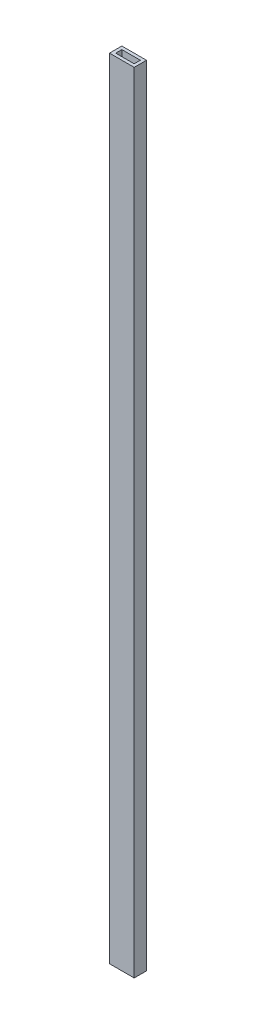
ISO-10303-21;
HEADER;
FILE_DESCRIPTION(('STEP AP214'),'2;1');
FILE_NAME('part.step','',(''),(''),'','','');
FILE_SCHEMA(('AUTOMOTIVE_DESIGN { 1 0 10303 214 1 1 1 1 }'));
ENDSEC;
DATA;
#1=APPLICATION_CONTEXT('core data for automotive mechanical design processes');
#2=APPLICATION_PROTOCOL_DEFINITION('international standard','automotive_design',2000,#1);
#3=PRODUCT_CONTEXT('',#1,'mechanical');
#4=PRODUCT('Part','Part','',(#3));
#5=PRODUCT_RELATED_PRODUCT_CATEGORY('part','',(#4));
#6=PRODUCT_DEFINITION_FORMATION('','',#4);
#7=PRODUCT_DEFINITION_CONTEXT('part definition',#1,'design');
#8=PRODUCT_DEFINITION('design','',#6,#7);
#9=PRODUCT_DEFINITION_SHAPE('','',#8);
#10=(LENGTH_UNIT() NAMED_UNIT(*) SI_UNIT(.MILLI.,.METRE.));
#11=(NAMED_UNIT(*) PLANE_ANGLE_UNIT() SI_UNIT($,.RADIAN.));
#12=(NAMED_UNIT(*) SI_UNIT($,.STERADIAN.) SOLID_ANGLE_UNIT());
#13=UNCERTAINTY_MEASURE_WITH_UNIT(LENGTH_MEASURE(1.E-05),#10,'distance_accuracy_value','');
#14=(GEOMETRIC_REPRESENTATION_CONTEXT(3) GLOBAL_UNCERTAINTY_ASSIGNED_CONTEXT((#13)) GLOBAL_UNIT_ASSIGNED_CONTEXT((#10,
#11,#12)) REPRESENTATION_CONTEXT('',''));
#15=CARTESIAN_POINT('',(0.,0.,0.));
#16=DIRECTION('',(0.,0.,1.));
#17=DIRECTION('',(1.,0.,0.));
#18=AXIS2_PLACEMENT_3D('',#15,#16,#17);
#19=CARTESIAN_POINT('',(0.,812.8,0.));
#20=DIRECTION('',(0.,1.,0.));
#21=DIRECTION('',(0.,0.,1.));
#22=AXIS2_PLACEMENT_3D('',#19,#20,#21);
#23=PLANE('',#22);
#24=DIRECTION('',(0.,0.,1.));
#25=VECTOR('',#24,1.);
#26=CARTESIAN_POINT('',(0.,812.8,0.));
#27=LINE('',#26,#25);
#28=CARTESIAN_POINT('',(0.,812.8,-12.7));
#29=VERTEX_POINT('',#28);
#30=CARTESIAN_POINT('',(0.,812.8,0.));
#31=VERTEX_POINT('',#30);
#32=EDGE_CURVE('E158',#29,#31,#27,.T.);
#33=ORIENTED_EDGE('',*,*,#32,.T.);
#34=DIRECTION('',(1.,0.,0.));
#35=VECTOR('',#34,1.);
#36=CARTESIAN_POINT('',(0.,812.8,0.));
#37=LINE('',#36,#35);
#38=CARTESIAN_POINT('',(25.4,812.8,0.));
#39=VERTEX_POINT('',#38);
#40=EDGE_CURVE('E161',#31,#39,#37,.T.);
#41=ORIENTED_EDGE('',*,*,#40,.T.);
#42=DIRECTION('',(0.,0.,-1.));
#43=VECTOR('',#42,1.);
#44=CARTESIAN_POINT('',(25.4,812.8,0.));
#45=LINE('',#44,#43);
#46=CARTESIAN_POINT('',(25.4,812.8,-12.7));
#47=VERTEX_POINT('',#46);
#48=EDGE_CURVE('E164',#39,#47,#45,.T.);
#49=ORIENTED_EDGE('',*,*,#48,.T.);
#50=DIRECTION('',(-1.,0.,0.));
#51=VECTOR('',#50,1.);
#52=CARTESIAN_POINT('',(0.,812.8,-12.7));
#53=LINE('',#52,#51);
#54=EDGE_CURVE('E166',#47,#29,#53,.T.);
#55=ORIENTED_EDGE('',*,*,#54,.T.);
#56=EDGE_LOOP('',(#33,#41,#49,#55));
#57=FACE_BOUND('',#56,.T.);
#58=DIRECTION('',(1.,0.,0.));
#59=VECTOR('',#58,1.);
#60=CARTESIAN_POINT('',(0.,812.8,-3.175));
#61=LINE('',#60,#59);
#62=CARTESIAN_POINT('',(3.175,812.8,-3.175));
#63=VERTEX_POINT('',#62);
#64=CARTESIAN_POINT('',(22.225,812.8,-3.175));
#65=VERTEX_POINT('',#64);
#66=EDGE_CURVE('E130',#63,#65,#61,.T.);
#67=ORIENTED_EDGE('',*,*,#66,.F.);
#68=DIRECTION('',(0.,0.,1.));
#69=VECTOR('',#68,1.);
#70=CARTESIAN_POINT('',(3.175,812.8,0.));
#71=LINE('',#70,#69);
#72=CARTESIAN_POINT('',(3.175,812.8,-9.525));
#73=VERTEX_POINT('',#72);
#74=EDGE_CURVE('E122',#73,#63,#71,.T.);
#75=ORIENTED_EDGE('',*,*,#74,.F.);
#76=DIRECTION('',(-1.,0.,0.));
#77=VECTOR('',#76,1.);
#78=CARTESIAN_POINT('',(0.,812.8,-9.525));
#79=LINE('',#78,#77);
#80=CARTESIAN_POINT('',(22.225,812.8,-9.525));
#81=VERTEX_POINT('',#80);
#82=EDGE_CURVE('E144',#81,#73,#79,.T.);
#83=ORIENTED_EDGE('',*,*,#82,.F.);
#84=DIRECTION('',(0.,0.,-1.));
#85=VECTOR('',#84,1.);
#86=CARTESIAN_POINT('',(22.225,812.8,0.));
#87=LINE('',#86,#85);
#88=EDGE_CURVE('E142',#65,#81,#87,.T.);
#89=ORIENTED_EDGE('',*,*,#88,.F.);
#90=EDGE_LOOP('',(#67,#75,#83,#89));
#91=FACE_BOUND('',#90,.T.);
#92=ADVANCED_FACE('F57',(#57,#91),#23,.T.);
#93=CARTESIAN_POINT('',(0.,0.,0.));
#94=DIRECTION('',(0.,1.,0.));
#95=DIRECTION('',(0.,0.,1.));
#96=AXIS2_PLACEMENT_3D('',#93,#94,#95);
#97=PLANE('',#96);
#98=DIRECTION('',(0.,0.,1.));
#99=VECTOR('',#98,1.);
#100=CARTESIAN_POINT('',(0.,0.,0.));
#101=LINE('',#100,#99);
#102=CARTESIAN_POINT('',(0.,0.,-12.7));
#103=VERTEX_POINT('',#102);
#104=CARTESIAN_POINT('',(0.,0.,0.));
#105=VERTEX_POINT('',#104);
#106=EDGE_CURVE('E138',#103,#105,#101,.T.);
#107=ORIENTED_EDGE('',*,*,#106,.F.);
#108=DIRECTION('',(-1.,0.,0.));
#109=VECTOR('',#108,1.);
#110=CARTESIAN_POINT('',(0.,0.,-12.7));
#111=LINE('',#110,#109);
#112=CARTESIAN_POINT('',(25.4,0.,-12.7));
#113=VERTEX_POINT('',#112);
#114=EDGE_CURVE('E162',#113,#103,#111,.T.);
#115=ORIENTED_EDGE('',*,*,#114,.F.);
#116=DIRECTION('',(0.,0.,-1.));
#117=VECTOR('',#116,1.);
#118=CARTESIAN_POINT('',(25.4,0.,0.));
#119=LINE('',#118,#117);
#120=CARTESIAN_POINT('',(25.4,0.,0.));
#121=VERTEX_POINT('',#120);
#122=EDGE_CURVE('E173',#121,#113,#119,.T.);
#123=ORIENTED_EDGE('',*,*,#122,.F.);
#124=DIRECTION('',(1.,0.,0.));
#125=VECTOR('',#124,1.);
#126=CARTESIAN_POINT('',(0.,0.,0.));
#127=LINE('',#126,#125);
#128=EDGE_CURVE('E171',#105,#121,#127,.T.);
#129=ORIENTED_EDGE('',*,*,#128,.F.);
#130=EDGE_LOOP('',(#107,#115,#123,#129));
#131=FACE_BOUND('',#130,.T.);
#132=DIRECTION('',(0.,0.,1.));
#133=VECTOR('',#132,1.);
#134=CARTESIAN_POINT('',(3.175,0.,0.));
#135=LINE('',#134,#133);
#136=CARTESIAN_POINT('',(3.175,0.,-9.525));
#137=VERTEX_POINT('',#136);
#138=CARTESIAN_POINT('',(3.175,0.,-3.175));
#139=VERTEX_POINT('',#138);
#140=EDGE_CURVE('E80',#137,#139,#135,.T.);
#141=ORIENTED_EDGE('',*,*,#140,.T.);
#142=DIRECTION('',(1.,0.,0.));
#143=VECTOR('',#142,1.);
#144=CARTESIAN_POINT('',(0.,0.,-3.175));
#145=LINE('',#144,#143);
#146=CARTESIAN_POINT('',(22.225,0.,-3.175));
#147=VERTEX_POINT('',#146);
#148=EDGE_CURVE('E137',#139,#147,#145,.T.);
#149=ORIENTED_EDGE('',*,*,#148,.T.);
#150=DIRECTION('',(0.,0.,-1.));
#151=VECTOR('',#150,1.);
#152=CARTESIAN_POINT('',(22.225,0.,0.));
#153=LINE('',#152,#151);
#154=CARTESIAN_POINT('',(22.225,0.,-9.525));
#155=VERTEX_POINT('',#154);
#156=EDGE_CURVE('E150',#147,#155,#153,.T.);
#157=ORIENTED_EDGE('',*,*,#156,.T.);
#158=DIRECTION('',(-1.,0.,0.));
#159=VECTOR('',#158,1.);
#160=CARTESIAN_POINT('',(0.,0.,-9.525));
#161=LINE('',#160,#159);
#162=EDGE_CURVE('E131',#155,#137,#161,.T.);
#163=ORIENTED_EDGE('',*,*,#162,.T.);
#164=EDGE_LOOP('',(#141,#149,#157,#163));
#165=FACE_BOUND('',#164,.T.);
#166=ADVANCED_FACE('F191',(#131,#165),#97,.F.);
#167=CARTESIAN_POINT('',(0.,812.8,0.));
#168=DIRECTION('',(1.,0.,0.));
#169=DIRECTION('',(0.,0.,-1.));
#170=AXIS2_PLACEMENT_3D('',#167,#168,#169);
#171=PLANE('',#170);
#172=ORIENTED_EDGE('',*,*,#106,.T.);
#173=DIRECTION('',(0.,-1.,0.));
#174=VECTOR('',#173,1.);
#175=CARTESIAN_POINT('',(0.,812.8,0.));
#176=LINE('',#175,#174);
#177=EDGE_CURVE('E12',#31,#105,#176,.T.);
#178=ORIENTED_EDGE('',*,*,#177,.F.);
#179=ORIENTED_EDGE('',*,*,#32,.F.);
#180=DIRECTION('',(0.,-1.,0.));
#181=VECTOR('',#180,1.);
#182=CARTESIAN_POINT('',(0.,812.8,-12.7));
#183=LINE('',#182,#181);
#184=EDGE_CURVE('E168',#29,#103,#183,.T.);
#185=ORIENTED_EDGE('',*,*,#184,.T.);
#186=EDGE_LOOP('',(#172,#178,#179,#185));
#187=FACE_BOUND('',#186,.T.);
#188=ADVANCED_FACE('F59',(#187),#171,.F.);
#189=CARTESIAN_POINT('',(0.,812.8,0.));
#190=DIRECTION('',(0.,0.,-1.));
#191=DIRECTION('',(-1.,0.,0.));
#192=AXIS2_PLACEMENT_3D('',#189,#190,#191);
#193=PLANE('',#192);
#194=ORIENTED_EDGE('',*,*,#128,.T.);
#195=DIRECTION('',(0.,-1.,0.));
#196=VECTOR('',#195,1.);
#197=CARTESIAN_POINT('',(25.4,812.8,0.));
#198=LINE('',#197,#196);
#199=EDGE_CURVE('E65',#39,#121,#198,.T.);
#200=ORIENTED_EDGE('',*,*,#199,.F.);
#201=ORIENTED_EDGE('',*,*,#40,.F.);
#202=ORIENTED_EDGE('',*,*,#177,.T.);
#203=EDGE_LOOP('',(#194,#200,#201,#202));
#204=FACE_BOUND('',#203,.T.);
#205=ADVANCED_FACE('F201',(#204),#193,.F.);
#206=CARTESIAN_POINT('',(25.4,812.8,0.));
#207=DIRECTION('',(-1.,0.,0.));
#208=DIRECTION('',(0.,0.,1.));
#209=AXIS2_PLACEMENT_3D('',#206,#207,#208);
#210=PLANE('',#209);
#211=ORIENTED_EDGE('',*,*,#122,.T.);
#212=DIRECTION('',(0.,-1.,0.));
#213=VECTOR('',#212,1.);
#214=CARTESIAN_POINT('',(25.4,812.8,-12.7));
#215=LINE('',#214,#213);
#216=EDGE_CURVE('E178',#47,#113,#215,.T.);
#217=ORIENTED_EDGE('',*,*,#216,.F.);
#218=ORIENTED_EDGE('',*,*,#48,.F.);
#219=ORIENTED_EDGE('',*,*,#199,.T.);
#220=EDGE_LOOP('',(#211,#217,#218,#219));
#221=FACE_BOUND('',#220,.T.);
#222=ADVANCED_FACE('F185',(#221),#210,.F.);
#223=CARTESIAN_POINT('',(0.,812.8,-12.7));
#224=DIRECTION('',(0.,0.,1.));
#225=DIRECTION('',(1.,0.,0.));
#226=AXIS2_PLACEMENT_3D('',#223,#224,#225);
#227=PLANE('',#226);
#228=ORIENTED_EDGE('',*,*,#114,.T.);
#229=ORIENTED_EDGE('',*,*,#184,.F.);
#230=ORIENTED_EDGE('',*,*,#54,.F.);
#231=ORIENTED_EDGE('',*,*,#216,.T.);
#232=EDGE_LOOP('',(#228,#229,#230,#231));
#233=FACE_BOUND('',#232,.T.);
#234=ADVANCED_FACE('F195',(#233),#227,.F.);
#235=CARTESIAN_POINT('',(3.175,812.8,0.));
#236=DIRECTION('',(1.,0.,0.));
#237=DIRECTION('',(0.,0.,-1.));
#238=AXIS2_PLACEMENT_3D('',#235,#236,#237);
#239=PLANE('',#238);
#240=ORIENTED_EDGE('',*,*,#140,.F.);
#241=DIRECTION('',(0.,-1.,0.));
#242=VECTOR('',#241,1.);
#243=CARTESIAN_POINT('',(3.175,812.8,-9.525));
#244=LINE('',#243,#242);
#245=EDGE_CURVE('E126',#73,#137,#244,.T.);
#246=ORIENTED_EDGE('',*,*,#245,.F.);
#247=ORIENTED_EDGE('',*,*,#74,.T.);
#248=DIRECTION('',(0.,-1.,0.));
#249=VECTOR('',#248,1.);
#250=CARTESIAN_POINT('',(3.175,812.8,-3.175));
#251=LINE('',#250,#249);
#252=EDGE_CURVE('E125',#63,#139,#251,.T.);
#253=ORIENTED_EDGE('',*,*,#252,.T.);
#254=EDGE_LOOP('',(#240,#246,#247,#253));
#255=FACE_BOUND('',#254,.T.);
#256=ADVANCED_FACE('F124',(#255),#239,.T.);
#257=CARTESIAN_POINT('',(0.,812.8,-3.175));
#258=DIRECTION('',(0.,0.,-1.));
#259=DIRECTION('',(-1.,0.,0.));
#260=AXIS2_PLACEMENT_3D('',#257,#258,#259);
#261=PLANE('',#260);
#262=ORIENTED_EDGE('',*,*,#148,.F.);
#263=ORIENTED_EDGE('',*,*,#252,.F.);
#264=ORIENTED_EDGE('',*,*,#66,.T.);
#265=DIRECTION('',(0.,-1.,0.));
#266=VECTOR('',#265,1.);
#267=CARTESIAN_POINT('',(22.225,812.8,-3.175));
#268=LINE('',#267,#266);
#269=EDGE_CURVE('E139',#65,#147,#268,.T.);
#270=ORIENTED_EDGE('',*,*,#269,.T.);
#271=EDGE_LOOP('',(#262,#263,#264,#270));
#272=FACE_BOUND('',#271,.T.);
#273=ADVANCED_FACE('F134',(#272),#261,.T.);
#274=CARTESIAN_POINT('',(22.225,812.8,0.));
#275=DIRECTION('',(-1.,0.,0.));
#276=DIRECTION('',(0.,0.,1.));
#277=AXIS2_PLACEMENT_3D('',#274,#275,#276);
#278=PLANE('',#277);
#279=ORIENTED_EDGE('',*,*,#156,.F.);
#280=ORIENTED_EDGE('',*,*,#269,.F.);
#281=ORIENTED_EDGE('',*,*,#88,.T.);
#282=DIRECTION('',(0.,-1.,0.));
#283=VECTOR('',#282,1.);
#284=CARTESIAN_POINT('',(22.225,812.8,-9.525));
#285=LINE('',#284,#283);
#286=EDGE_CURVE('E72',#81,#155,#285,.T.);
#287=ORIENTED_EDGE('',*,*,#286,.T.);
#288=EDGE_LOOP('',(#279,#280,#281,#287));
#289=FACE_BOUND('',#288,.T.);
#290=ADVANCED_FACE('F224',(#289),#278,.T.);
#291=CARTESIAN_POINT('',(0.,812.8,-9.525));
#292=DIRECTION('',(0.,0.,1.));
#293=DIRECTION('',(1.,0.,0.));
#294=AXIS2_PLACEMENT_3D('',#291,#292,#293);
#295=PLANE('',#294);
#296=ORIENTED_EDGE('',*,*,#162,.F.);
#297=ORIENTED_EDGE('',*,*,#286,.F.);
#298=ORIENTED_EDGE('',*,*,#82,.T.);
#299=ORIENTED_EDGE('',*,*,#245,.T.);
#300=EDGE_LOOP('',(#296,#297,#298,#299));
#301=FACE_BOUND('',#300,.T.);
#302=ADVANCED_FACE('F228',(#301),#295,.T.);
#303=CLOSED_SHELL('',(#92,#166,#188,#205,#222,#234,#256,#273,#290,#302));
#304=MANIFOLD_SOLID_BREP('B2',#303);
#305=ADVANCED_BREP_SHAPE_REPRESENTATION('',(#18,#304),#14);
#306=SHAPE_DEFINITION_REPRESENTATION(#9,#305);
ENDSEC;
END-ISO-10303-21;
